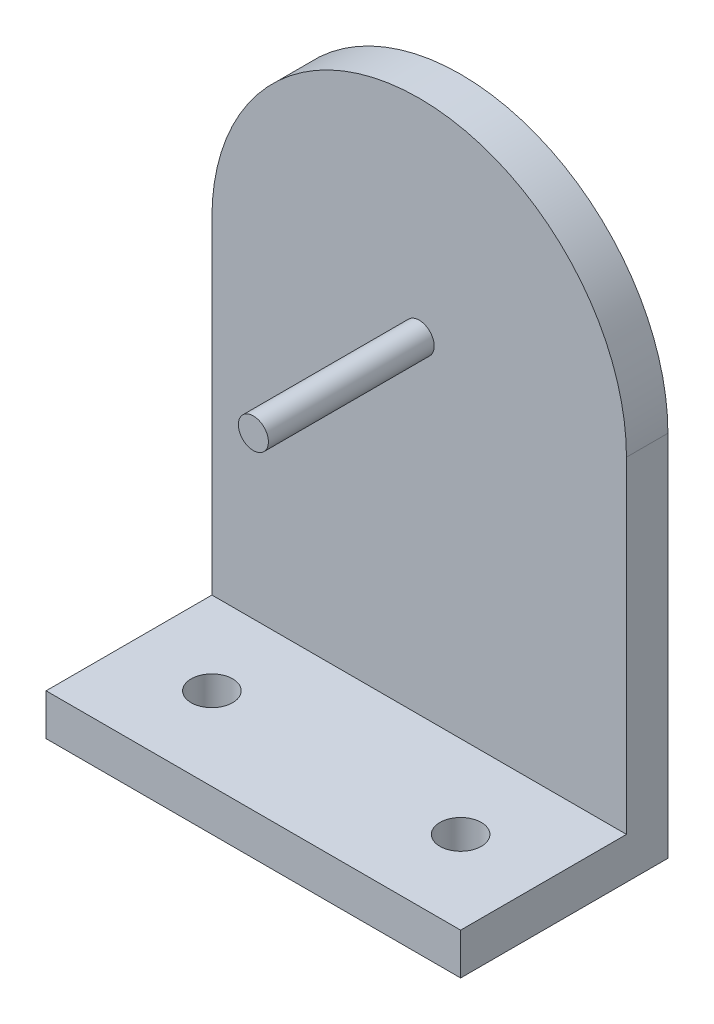
ISO-10303-21;
HEADER;
FILE_DESCRIPTION(('STEP AP214'),'2;1');
FILE_NAME('part.step','',(''),(''),'','','');
FILE_SCHEMA(('AUTOMOTIVE_DESIGN { 1 0 10303 214 1 1 1 1 }'));
ENDSEC;
DATA;
#1=APPLICATION_CONTEXT('core data for automotive mechanical design processes');
#2=APPLICATION_PROTOCOL_DEFINITION('international standard','automotive_design',2000,#1);
#3=PRODUCT_CONTEXT('',#1,'mechanical');
#4=PRODUCT('Part','Part','',(#3));
#5=PRODUCT_RELATED_PRODUCT_CATEGORY('part','',(#4));
#6=PRODUCT_DEFINITION_FORMATION('','',#4);
#7=PRODUCT_DEFINITION_CONTEXT('part definition',#1,'design');
#8=PRODUCT_DEFINITION('design','',#6,#7);
#9=PRODUCT_DEFINITION_SHAPE('','',#8);
#10=(LENGTH_UNIT() NAMED_UNIT(*) SI_UNIT(.MILLI.,.METRE.));
#11=(NAMED_UNIT(*) PLANE_ANGLE_UNIT() SI_UNIT($,.RADIAN.));
#12=(NAMED_UNIT(*) SI_UNIT($,.STERADIAN.) SOLID_ANGLE_UNIT());
#13=UNCERTAINTY_MEASURE_WITH_UNIT(LENGTH_MEASURE(1.E-05),#10,'distance_accuracy_value','');
#14=(GEOMETRIC_REPRESENTATION_CONTEXT(3) GLOBAL_UNCERTAINTY_ASSIGNED_CONTEXT((#13)) GLOBAL_UNIT_ASSIGNED_CONTEXT((#10,
#11,#12)) REPRESENTATION_CONTEXT('',''));
#15=CARTESIAN_POINT('',(0.,0.,0.));
#16=DIRECTION('',(0.,0.,1.));
#17=DIRECTION('',(1.,0.,0.));
#18=AXIS2_PLACEMENT_3D('',#15,#16,#17);
#19=CARTESIAN_POINT('',(0.,0.,3.175));
#20=DIRECTION('',(0.,0.,-1.));
#21=DIRECTION('',(-1.,0.,0.));
#22=AXIS2_PLACEMENT_3D('',#19,#20,#21);
#23=CYLINDRICAL_SURFACE('',#22,15.875);
#24=CARTESIAN_POINT('',(0.,0.,3.175));
#25=DIRECTION('',(0.,0.,1.));
#26=DIRECTION('',(1.,0.,0.));
#27=AXIS2_PLACEMENT_3D('',#24,#25,#26);
#28=CIRCLE('',#27,15.875);
#29=CARTESIAN_POINT('',(15.875,0.,3.175));
#30=VERTEX_POINT('',#29);
#31=CARTESIAN_POINT('',(-15.875,0.,3.175));
#32=VERTEX_POINT('',#31);
#33=EDGE_CURVE('E151',#30,#32,#28,.T.);
#34=ORIENTED_EDGE('',*,*,#33,.F.);
#35=DIRECTION('',(0.,0.,-1.));
#36=VECTOR('',#35,1.);
#37=CARTESIAN_POINT('',(15.875,0.,3.175));
#38=LINE('',#37,#36);
#39=CARTESIAN_POINT('',(15.875,0.,0.));
#40=VERTEX_POINT('',#39);
#41=EDGE_CURVE('E12',#30,#40,#38,.T.);
#42=ORIENTED_EDGE('',*,*,#41,.T.);
#43=CARTESIAN_POINT('',(0.,0.,0.));
#44=DIRECTION('',(0.,0.,1.));
#45=DIRECTION('',(1.,0.,0.));
#46=AXIS2_PLACEMENT_3D('',#43,#44,#45);
#47=CIRCLE('',#46,15.875);
#48=CARTESIAN_POINT('',(-15.875,0.,0.));
#49=VERTEX_POINT('',#48);
#50=EDGE_CURVE('E154',#40,#49,#47,.T.);
#51=ORIENTED_EDGE('',*,*,#50,.T.);
#52=DIRECTION('',(0.,0.,-1.));
#53=VECTOR('',#52,1.);
#54=CARTESIAN_POINT('',(-15.875,0.,3.175));
#55=LINE('',#54,#53);
#56=EDGE_CURVE('E67',#32,#49,#55,.T.);
#57=ORIENTED_EDGE('',*,*,#56,.F.);
#58=EDGE_LOOP('',(#34,#42,#51,#57));
#59=FACE_BOUND('',#58,.T.);
#60=ADVANCED_FACE('F58',(#59),#23,.T.);
#61=CARTESIAN_POINT('',(0.,0.,0.));
#62=DIRECTION('',(0.,0.,1.));
#63=DIRECTION('',(1.,0.,0.));
#64=AXIS2_PLACEMENT_3D('',#61,#62,#63);
#65=PLANE('',#64);
#66=ORIENTED_EDGE('',*,*,#50,.F.);
#67=DIRECTION('',(0.,-1.,0.));
#68=VECTOR('',#67,1.);
#69=CARTESIAN_POINT('',(15.875,0.,0.));
#70=LINE('',#69,#68);
#71=CARTESIAN_POINT('',(15.875,-28.194,0.));
#72=VERTEX_POINT('',#71);
#73=EDGE_CURVE('E161',#40,#72,#70,.T.);
#74=ORIENTED_EDGE('',*,*,#73,.T.);
#75=DIRECTION('',(1.,0.,0.));
#76=VECTOR('',#75,1.);
#77=CARTESIAN_POINT('',(-15.875,-28.194,0.));
#78=LINE('',#77,#76);
#79=CARTESIAN_POINT('',(-15.875,-28.194,0.));
#80=VERTEX_POINT('',#79);
#81=EDGE_CURVE('E150',#80,#72,#78,.T.);
#82=ORIENTED_EDGE('',*,*,#81,.F.);
#83=DIRECTION('',(0.,-1.,0.));
#84=VECTOR('',#83,1.);
#85=CARTESIAN_POINT('',(-15.875,0.,0.));
#86=LINE('',#85,#84);
#87=EDGE_CURVE('E99',#49,#80,#86,.T.);
#88=ORIENTED_EDGE('',*,*,#87,.F.);
#89=EDGE_LOOP('',(#66,#74,#82,#88));
#90=FACE_BOUND('',#89,.T.);
#91=ADVANCED_FACE('F166',(#90),#65,.F.);
#92=CARTESIAN_POINT('',(0.,0.,3.175));
#93=DIRECTION('',(0.,0.,1.));
#94=DIRECTION('',(1.,0.,0.));
#95=AXIS2_PLACEMENT_3D('',#92,#93,#94);
#96=PLANE('',#95);
#97=CARTESIAN_POINT('',(0.,0.,3.175));
#98=DIRECTION('',(0.,0.,1.));
#99=DIRECTION('',(1.,0.,0.));
#100=AXIS2_PLACEMENT_3D('',#97,#98,#99);
#101=CIRCLE('',#100,1.15);
#102=CARTESIAN_POINT('',(1.15,0.,3.175));
#103=VERTEX_POINT('',#102);
#104=EDGE_CURVE('E222',#103,#103,#101,.T.);
#105=ORIENTED_EDGE('',*,*,#104,.F.);
#106=EDGE_LOOP('',(#105));
#107=FACE_BOUND('',#106,.T.);
#108=DIRECTION('',(-1.,0.,0.));
#109=VECTOR('',#108,1.);
#110=CARTESIAN_POINT('',(-15.875,-25.019,3.175));
#111=LINE('',#110,#109);
#112=CARTESIAN_POINT('',(15.875,-25.019,3.175));
#113=VERTEX_POINT('',#112);
#114=CARTESIAN_POINT('',(-15.875,-25.019,3.175));
#115=VERTEX_POINT('',#114);
#116=EDGE_CURVE('E75',#113,#115,#111,.T.);
#117=ORIENTED_EDGE('',*,*,#116,.F.);
#118=DIRECTION('',(0.,-1.,0.));
#119=VECTOR('',#118,1.);
#120=CARTESIAN_POINT('',(15.875,0.,3.175));
#121=LINE('',#120,#119);
#122=EDGE_CURVE('E157',#30,#113,#121,.T.);
#123=ORIENTED_EDGE('',*,*,#122,.F.);
#124=ORIENTED_EDGE('',*,*,#33,.T.);
#125=DIRECTION('',(0.,-1.,0.));
#126=VECTOR('',#125,1.);
#127=CARTESIAN_POINT('',(-15.875,0.,3.175));
#128=LINE('',#127,#126);
#129=EDGE_CURVE('E125',#32,#115,#128,.T.);
#130=ORIENTED_EDGE('',*,*,#129,.T.);
#131=EDGE_LOOP('',(#117,#123,#124,#130));
#132=FACE_BOUND('',#131,.T.);
#133=ADVANCED_FACE('F172',(#107,#132),#96,.T.);
#134=CARTESIAN_POINT('',(-15.875,0.,3.175));
#135=DIRECTION('',(1.,0.,0.));
#136=DIRECTION('',(0.,1.,0.));
#137=AXIS2_PLACEMENT_3D('',#134,#135,#136);
#138=PLANE('',#137);
#139=ORIENTED_EDGE('',*,*,#87,.T.);
#140=DIRECTION('',(0.,0.,-1.));
#141=VECTOR('',#140,1.);
#142=CARTESIAN_POINT('',(-15.875,-28.194,3.175));
#143=LINE('',#142,#141);
#144=CARTESIAN_POINT('',(-15.875,-28.194,15.875));
#145=VERTEX_POINT('',#144);
#146=EDGE_CURVE('E116',#145,#80,#143,.T.);
#147=ORIENTED_EDGE('',*,*,#146,.F.);
#148=DIRECTION('',(0.,-1.,0.));
#149=VECTOR('',#148,1.);
#150=CARTESIAN_POINT('',(-15.875,-28.194,15.875));
#151=LINE('',#150,#149);
#152=CARTESIAN_POINT('',(-15.875,-25.019,15.875));
#153=VERTEX_POINT('',#152);
#154=EDGE_CURVE('E121',#153,#145,#151,.T.);
#155=ORIENTED_EDGE('',*,*,#154,.F.);
#156=DIRECTION('',(0.,0.,-1.));
#157=VECTOR('',#156,1.);
#158=CARTESIAN_POINT('',(-15.875,-25.019,15.875));
#159=LINE('',#158,#157);
#160=EDGE_CURVE('E144',#153,#115,#159,.T.);
#161=ORIENTED_EDGE('',*,*,#160,.T.);
#162=ORIENTED_EDGE('',*,*,#129,.F.);
#163=ORIENTED_EDGE('',*,*,#56,.T.);
#164=EDGE_LOOP('',(#139,#147,#155,#161,#162,#163));
#165=FACE_BOUND('',#164,.T.);
#166=ADVANCED_FACE('F118',(#165),#138,.F.);
#167=CARTESIAN_POINT('',(-15.875,-28.194,3.175));
#168=DIRECTION('',(0.,1.,0.));
#169=DIRECTION('',(0.,0.,1.));
#170=AXIS2_PLACEMENT_3D('',#167,#168,#169);
#171=PLANE('',#170);
#172=CARTESIAN_POINT('',(-9.525,-28.194,9.525));
#173=DIRECTION('',(0.,1.,0.));
#174=DIRECTION('',(0.,0.,1.));
#175=AXIS2_PLACEMENT_3D('',#172,#173,#174);
#176=CIRCLE('',#175,1.5875);
#177=CARTESIAN_POINT('',(-9.525,-28.194,11.1125));
#178=VERTEX_POINT('',#177);
#179=EDGE_CURVE('E137',#178,#178,#176,.T.);
#180=ORIENTED_EDGE('',*,*,#179,.T.);
#181=EDGE_LOOP('',(#180));
#182=FACE_BOUND('',#181,.T.);
#183=CARTESIAN_POINT('',(9.52500000000001,-28.194,9.52500000000001));
#184=DIRECTION('',(0.,1.,0.));
#185=DIRECTION('',(0.,0.,-1.));
#186=AXIS2_PLACEMENT_3D('',#183,#184,#185);
#187=CIRCLE('',#186,1.5875);
#188=CARTESIAN_POINT('',(9.52500000000001,-28.194,7.93750000000001));
#189=VERTEX_POINT('',#188);
#190=EDGE_CURVE('E140',#189,#189,#187,.T.);
#191=ORIENTED_EDGE('',*,*,#190,.T.);
#192=EDGE_LOOP('',(#191));
#193=FACE_BOUND('',#192,.T.);
#194=ORIENTED_EDGE('',*,*,#81,.T.);
#195=DIRECTION('',(0.,0.,-1.));
#196=VECTOR('',#195,1.);
#197=CARTESIAN_POINT('',(15.875,-28.194,3.175));
#198=LINE('',#197,#196);
#199=CARTESIAN_POINT('',(15.875,-28.194,15.875));
#200=VERTEX_POINT('',#199);
#201=EDGE_CURVE('E62',#200,#72,#198,.T.);
#202=ORIENTED_EDGE('',*,*,#201,.F.);
#203=DIRECTION('',(1.,0.,0.));
#204=VECTOR('',#203,1.);
#205=CARTESIAN_POINT('',(-15.875,-28.194,15.875));
#206=LINE('',#205,#204);
#207=EDGE_CURVE('E127',#145,#200,#206,.T.);
#208=ORIENTED_EDGE('',*,*,#207,.F.);
#209=ORIENTED_EDGE('',*,*,#146,.T.);
#210=EDGE_LOOP('',(#194,#202,#208,#209));
#211=FACE_BOUND('',#210,.T.);
#212=ADVANCED_FACE('F60',(#182,#193,#211),#171,.F.);
#213=CARTESIAN_POINT('',(15.875,0.,3.175));
#214=DIRECTION('',(1.,0.,0.));
#215=DIRECTION('',(0.,1.,0.));
#216=AXIS2_PLACEMENT_3D('',#213,#214,#215);
#217=PLANE('',#216);
#218=ORIENTED_EDGE('',*,*,#73,.F.);
#219=ORIENTED_EDGE('',*,*,#41,.F.);
#220=ORIENTED_EDGE('',*,*,#122,.T.);
#221=DIRECTION('',(0.,0.,-1.));
#222=VECTOR('',#221,1.);
#223=CARTESIAN_POINT('',(15.875,-25.019,15.875));
#224=LINE('',#223,#222);
#225=CARTESIAN_POINT('',(15.875,-25.019,15.875));
#226=VERTEX_POINT('',#225);
#227=EDGE_CURVE('E147',#226,#113,#224,.T.);
#228=ORIENTED_EDGE('',*,*,#227,.F.);
#229=DIRECTION('',(0.,1.,0.));
#230=VECTOR('',#229,1.);
#231=CARTESIAN_POINT('',(15.875,-28.194,15.875));
#232=LINE('',#231,#230);
#233=EDGE_CURVE('E130',#200,#226,#232,.T.);
#234=ORIENTED_EDGE('',*,*,#233,.F.);
#235=ORIENTED_EDGE('',*,*,#201,.T.);
#236=EDGE_LOOP('',(#218,#219,#220,#228,#234,#235));
#237=FACE_BOUND('',#236,.T.);
#238=ADVANCED_FACE('F168',(#237),#217,.T.);
#239=CARTESIAN_POINT('',(-15.875,-25.019,15.875));
#240=DIRECTION('',(0.,-1.,0.));
#241=DIRECTION('',(0.,0.,-1.));
#242=AXIS2_PLACEMENT_3D('',#239,#240,#241);
#243=PLANE('',#242);
#244=CARTESIAN_POINT('',(-9.525,-25.019,9.525));
#245=DIRECTION('',(0.,1.,0.));
#246=DIRECTION('',(0.,0.,1.));
#247=AXIS2_PLACEMENT_3D('',#244,#245,#246);
#248=CIRCLE('',#247,1.5875);
#249=CARTESIAN_POINT('',(-9.525,-25.019,11.1125));
#250=VERTEX_POINT('',#249);
#251=EDGE_CURVE('E230',#250,#250,#248,.T.);
#252=ORIENTED_EDGE('',*,*,#251,.F.);
#253=EDGE_LOOP('',(#252));
#254=FACE_BOUND('',#253,.T.);
#255=CARTESIAN_POINT('',(9.52500000000001,-25.019,9.52500000000001));
#256=DIRECTION('',(0.,1.,0.));
#257=DIRECTION('',(0.,0.,-1.));
#258=AXIS2_PLACEMENT_3D('',#255,#256,#257);
#259=CIRCLE('',#258,1.5875);
#260=CARTESIAN_POINT('',(9.52500000000001,-25.019,7.93750000000001));
#261=VERTEX_POINT('',#260);
#262=EDGE_CURVE('E225',#261,#261,#259,.T.);
#263=ORIENTED_EDGE('',*,*,#262,.F.);
#264=EDGE_LOOP('',(#263));
#265=FACE_BOUND('',#264,.T.);
#266=ORIENTED_EDGE('',*,*,#116,.T.);
#267=ORIENTED_EDGE('',*,*,#160,.F.);
#268=DIRECTION('',(-1.,0.,0.));
#269=VECTOR('',#268,1.);
#270=CARTESIAN_POINT('',(-15.875,-25.019,15.875));
#271=LINE('',#270,#269);
#272=EDGE_CURVE('E134',#226,#153,#271,.T.);
#273=ORIENTED_EDGE('',*,*,#272,.F.);
#274=ORIENTED_EDGE('',*,*,#227,.T.);
#275=EDGE_LOOP('',(#266,#267,#273,#274));
#276=FACE_BOUND('',#275,.T.);
#277=ADVANCED_FACE('F171',(#254,#265,#276),#243,.F.);
#278=CARTESIAN_POINT('',(0.,0.,15.875));
#279=DIRECTION('',(0.,0.,-1.));
#280=DIRECTION('',(-1.,0.,0.));
#281=AXIS2_PLACEMENT_3D('',#278,#279,#280);
#282=PLANE('',#281);
#283=ORIENTED_EDGE('',*,*,#154,.T.);
#284=ORIENTED_EDGE('',*,*,#207,.T.);
#285=ORIENTED_EDGE('',*,*,#233,.T.);
#286=ORIENTED_EDGE('',*,*,#272,.T.);
#287=EDGE_LOOP('',(#283,#284,#285,#286));
#288=FACE_BOUND('',#287,.T.);
#289=ADVANCED_FACE('F132',(#288),#282,.F.);
#290=CARTESIAN_POINT('',(9.52500000000001,-28.194,9.52500000000001));
#291=DIRECTION('',(0.,1.,0.));
#292=DIRECTION('',(0.,0.,1.));
#293=AXIS2_PLACEMENT_3D('',#290,#291,#292);
#294=CYLINDRICAL_SURFACE('',#293,1.5875);
#295=ORIENTED_EDGE('',*,*,#190,.F.);
#296=EDGE_LOOP('',(#295));
#297=FACE_BOUND('',#296,.T.);
#298=ORIENTED_EDGE('',*,*,#262,.T.);
#299=EDGE_LOOP('',(#298));
#300=FACE_BOUND('',#299,.T.);
#301=ADVANCED_FACE('F204',(#297,#300),#294,.F.);
#302=CARTESIAN_POINT('',(-9.525,-28.194,9.525));
#303=DIRECTION('',(0.,1.,0.));
#304=DIRECTION('',(0.,0.,1.));
#305=AXIS2_PLACEMENT_3D('',#302,#303,#304);
#306=CYLINDRICAL_SURFACE('',#305,1.5875);
#307=ORIENTED_EDGE('',*,*,#179,.F.);
#308=EDGE_LOOP('',(#307));
#309=FACE_BOUND('',#308,.T.);
#310=ORIENTED_EDGE('',*,*,#251,.T.);
#311=EDGE_LOOP('',(#310));
#312=FACE_BOUND('',#311,.T.);
#313=ADVANCED_FACE('F207',(#309,#312),#306,.F.);
#314=CARTESIAN_POINT('',(0.,0.,15.875));
#315=DIRECTION('',(0.,0.,-1.));
#316=DIRECTION('',(-1.,0.,0.));
#317=AXIS2_PLACEMENT_3D('',#314,#315,#316);
#318=CYLINDRICAL_SURFACE('',#317,1.15);
#319=CARTESIAN_POINT('',(0.,0.,15.875));
#320=DIRECTION('',(0.,0.,1.));
#321=DIRECTION('',(1.,0.,0.));
#322=AXIS2_PLACEMENT_3D('',#319,#320,#321);
#323=CIRCLE('',#322,1.15);
#324=CARTESIAN_POINT('',(1.15,0.,15.875));
#325=VERTEX_POINT('',#324);
#326=EDGE_CURVE('E221',#325,#325,#323,.T.);
#327=ORIENTED_EDGE('',*,*,#326,.F.);
#328=EDGE_LOOP('',(#327));
#329=FACE_BOUND('',#328,.T.);
#330=ORIENTED_EDGE('',*,*,#104,.T.);
#331=EDGE_LOOP('',(#330));
#332=FACE_BOUND('',#331,.T.);
#333=ADVANCED_FACE('F210',(#329,#332),#318,.T.);
#334=CARTESIAN_POINT('',(0.,0.,15.875));
#335=DIRECTION('',(0.,0.,1.));
#336=DIRECTION('',(1.,0.,0.));
#337=AXIS2_PLACEMENT_3D('',#334,#335,#336);
#338=PLANE('',#337);
#339=ORIENTED_EDGE('',*,*,#326,.T.);
#340=EDGE_LOOP('',(#339));
#341=FACE_BOUND('',#340,.T.);
#342=ADVANCED_FACE('F213',(#341),#338,.T.);
#343=CLOSED_SHELL('',(#60,#91,#133,#166,#212,#238,#277,#289,#301,#313,#333,#342));
#344=MANIFOLD_SOLID_BREP('B2',#343);
#345=ADVANCED_BREP_SHAPE_REPRESENTATION('',(#18,#344),#14);
#346=SHAPE_DEFINITION_REPRESENTATION(#9,#345);
ENDSEC;
END-ISO-10303-21;
